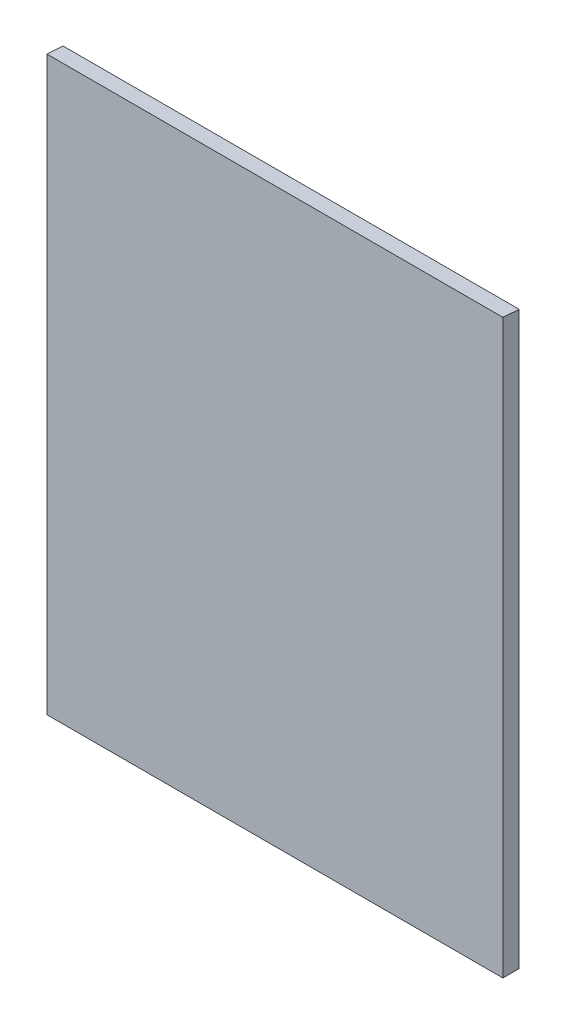
ISO-10303-21;
HEADER;
FILE_DESCRIPTION(('STEP AP214'),'2;1');
FILE_NAME('part.step','',(''),(''),'','','');
FILE_SCHEMA(('AUTOMOTIVE_DESIGN { 1 0 10303 214 1 1 1 1 }'));
ENDSEC;
DATA;
#1=APPLICATION_CONTEXT('core data for automotive mechanical design processes');
#2=APPLICATION_PROTOCOL_DEFINITION('international standard','automotive_design',2000,#1);
#3=PRODUCT_CONTEXT('',#1,'mechanical');
#4=PRODUCT('Part','Part','',(#3));
#5=PRODUCT_RELATED_PRODUCT_CATEGORY('part','',(#4));
#6=PRODUCT_DEFINITION_FORMATION('','',#4);
#7=PRODUCT_DEFINITION_CONTEXT('part definition',#1,'design');
#8=PRODUCT_DEFINITION('design','',#6,#7);
#9=PRODUCT_DEFINITION_SHAPE('','',#8);
#10=(LENGTH_UNIT() NAMED_UNIT(*) SI_UNIT(.MILLI.,.METRE.));
#11=(NAMED_UNIT(*) PLANE_ANGLE_UNIT() SI_UNIT($,.RADIAN.));
#12=(NAMED_UNIT(*) SI_UNIT($,.STERADIAN.) SOLID_ANGLE_UNIT());
#13=UNCERTAINTY_MEASURE_WITH_UNIT(LENGTH_MEASURE(1.E-05),#10,'distance_accuracy_value','');
#14=(GEOMETRIC_REPRESENTATION_CONTEXT(3) GLOBAL_UNCERTAINTY_ASSIGNED_CONTEXT((#13)) GLOBAL_UNIT_ASSIGNED_CONTEXT((#10,
#11,#12)) REPRESENTATION_CONTEXT('',''));
#15=CARTESIAN_POINT('',(0.,0.,0.));
#16=DIRECTION('',(0.,0.,1.));
#17=DIRECTION('',(1.,0.,0.));
#18=AXIS2_PLACEMENT_3D('',#15,#16,#17);
#19=CARTESIAN_POINT('',(-266.573,2683.51,-19.05));
#20=DIRECTION('',(-1.,0.,0.));
#21=DIRECTION('',(0.,0.,1.));
#22=AXIS2_PLACEMENT_3D('',#19,#20,#21);
#23=PLANE('',#22);
#24=DIRECTION('',(0.,0.0748289111293787,0.997196386906407));
#25=VECTOR('',#24,1.);
#26=CARTESIAN_POINT('',(-266.573,3343.69095387078,-114.853775760798));
#27=LINE('',#26,#25);
#28=CARTESIAN_POINT('',(-266.573,3350.88000140083,-19.05));
#29=VERTEX_POINT('',#28);
#30=CARTESIAN_POINT('',(-266.573,3352.30949974709,0.));
#31=VERTEX_POINT('',#30);
#32=EDGE_CURVE('E65',#29,#31,#27,.T.);
#33=ORIENTED_EDGE('',*,*,#32,.F.);
#34=DIRECTION('',(0.,-1.,0.));
#35=VECTOR('',#34,1.);
#36=CARTESIAN_POINT('',(-266.573,2683.51,-19.05));
#37=LINE('',#36,#35);
#38=CARTESIAN_POINT('',(-266.573,2683.51,-19.05));
#39=VERTEX_POINT('',#38);
#40=EDGE_CURVE('E90',#29,#39,#37,.T.);
#41=ORIENTED_EDGE('',*,*,#40,.T.);
#42=DIRECTION('',(0.,0.,1.));
#43=VECTOR('',#42,1.);
#44=CARTESIAN_POINT('',(-266.573,2683.51,-19.05));
#45=LINE('',#44,#43);
#46=CARTESIAN_POINT('',(-266.573,2683.51,0.));
#47=VERTEX_POINT('',#46);
#48=EDGE_CURVE('E36',#39,#47,#45,.T.);
#49=ORIENTED_EDGE('',*,*,#48,.T.);
#50=DIRECTION('',(0.,-1.,0.));
#51=VECTOR('',#50,1.);
#52=CARTESIAN_POINT('',(-266.573,2683.51,0.));
#53=LINE('',#52,#51);
#54=EDGE_CURVE('E81',#31,#47,#53,.T.);
#55=ORIENTED_EDGE('',*,*,#54,.F.);
#56=EDGE_LOOP('',(#33,#41,#49,#55));
#57=FACE_BOUND('',#56,.T.);
#58=ADVANCED_FACE('F33',(#57),#23,.T.);
#59=CARTESIAN_POINT('',(266.573,2683.51,-19.05));
#60=DIRECTION('',(1.,0.,0.));
#61=DIRECTION('',(0.,1.,0.));
#62=AXIS2_PLACEMENT_3D('',#59,#60,#61);
#63=PLANE('',#62);
#64=DIRECTION('',(0.,0.0748289111293787,0.997196386906407));
#65=VECTOR('',#64,1.);
#66=CARTESIAN_POINT('',(266.573,3343.69095387078,-114.853775760798));
#67=LINE('',#66,#65);
#68=CARTESIAN_POINT('',(266.573,3350.88000140083,-19.05));
#69=VERTEX_POINT('',#68);
#70=CARTESIAN_POINT('',(266.573,3352.30949974709,-2.28561791715265E-06));
#71=VERTEX_POINT('',#70);
#72=EDGE_CURVE('E78',#69,#71,#67,.T.);
#73=ORIENTED_EDGE('',*,*,#72,.T.);
#74=DIRECTION('',(0.,1.,0.));
#75=VECTOR('',#74,1.);
#76=CARTESIAN_POINT('',(266.573,2683.51,0.));
#77=LINE('',#76,#75);
#78=CARTESIAN_POINT('',(266.573,2683.51,0.));
#79=VERTEX_POINT('',#78);
#80=EDGE_CURVE('E89',#79,#71,#77,.T.);
#81=ORIENTED_EDGE('',*,*,#80,.F.);
#82=DIRECTION('',(0.,0.,1.));
#83=VECTOR('',#82,1.);
#84=CARTESIAN_POINT('',(266.573,2683.51,-19.05));
#85=LINE('',#84,#83);
#86=CARTESIAN_POINT('',(266.573,2683.51,-19.05));
#87=VERTEX_POINT('',#86);
#88=EDGE_CURVE('E11',#87,#79,#85,.T.);
#89=ORIENTED_EDGE('',*,*,#88,.F.);
#90=DIRECTION('',(0.,1.,0.));
#91=VECTOR('',#90,1.);
#92=CARTESIAN_POINT('',(266.573,2683.51,-19.05));
#93=LINE('',#92,#91);
#94=EDGE_CURVE('E97',#87,#69,#93,.T.);
#95=ORIENTED_EDGE('',*,*,#94,.T.);
#96=EDGE_LOOP('',(#73,#81,#89,#95));
#97=FACE_BOUND('',#96,.T.);
#98=ADVANCED_FACE('F101',(#97),#63,.T.);
#99=CARTESIAN_POINT('',(-266.573,2683.51,-19.05));
#100=DIRECTION('',(0.,-1.,0.));
#101=DIRECTION('',(0.,0.,-1.));
#102=AXIS2_PLACEMENT_3D('',#99,#100,#101);
#103=PLANE('',#102);
#104=DIRECTION('',(1.,0.,0.));
#105=VECTOR('',#104,1.);
#106=CARTESIAN_POINT('',(-266.573,2683.51,0.));
#107=LINE('',#106,#105);
#108=EDGE_CURVE('E85',#47,#79,#107,.T.);
#109=ORIENTED_EDGE('',*,*,#108,.F.);
#110=ORIENTED_EDGE('',*,*,#48,.F.);
#111=DIRECTION('',(1.,0.,0.));
#112=VECTOR('',#111,1.);
#113=CARTESIAN_POINT('',(-266.573,2683.51,-19.05));
#114=LINE('',#113,#112);
#115=EDGE_CURVE('E92',#39,#87,#114,.T.);
#116=ORIENTED_EDGE('',*,*,#115,.T.);
#117=ORIENTED_EDGE('',*,*,#88,.T.);
#118=EDGE_LOOP('',(#109,#110,#116,#117));
#119=FACE_BOUND('',#118,.T.);
#120=ADVANCED_FACE('F107',(#119),#103,.T.);
#121=CARTESIAN_POINT('',(0.,0.,-19.05));
#122=DIRECTION('',(0.,0.,-1.));
#123=DIRECTION('',(-1.,0.,0.));
#124=AXIS2_PLACEMENT_3D('',#121,#122,#123);
#125=PLANE('',#124);
#126=DIRECTION('',(-1.,0.,0.));
#127=VECTOR('',#126,1.);
#128=CARTESIAN_POINT('',(0.,3350.88000140083,-19.05));
#129=LINE('',#128,#127);
#130=EDGE_CURVE('E75',#69,#29,#129,.T.);
#131=ORIENTED_EDGE('',*,*,#130,.F.);
#132=ORIENTED_EDGE('',*,*,#94,.F.);
#133=ORIENTED_EDGE('',*,*,#115,.F.);
#134=ORIENTED_EDGE('',*,*,#40,.F.);
#135=EDGE_LOOP('',(#131,#132,#133,#134));
#136=FACE_BOUND('',#135,.T.);
#137=ADVANCED_FACE('F104',(#136),#125,.T.);
#138=CARTESIAN_POINT('',(0.,0.,0.));
#139=DIRECTION('',(0.,0.,-1.));
#140=DIRECTION('',(-1.,0.,0.));
#141=AXIS2_PLACEMENT_3D('',#138,#139,#140);
#142=PLANE('',#141);
#143=ORIENTED_EDGE('',*,*,#54,.T.);
#144=ORIENTED_EDGE('',*,*,#108,.T.);
#145=ORIENTED_EDGE('',*,*,#80,.T.);
#146=DIRECTION('',(-1.,0.,0.));
#147=VECTOR('',#146,1.);
#148=CARTESIAN_POINT('',(-266.573,3352.30949974709,0.));
#149=LINE('',#148,#147);
#150=EDGE_CURVE('E71',#71,#31,#149,.T.);
#151=ORIENTED_EDGE('',*,*,#150,.T.);
#152=EDGE_LOOP('',(#143,#144,#145,#151));
#153=FACE_BOUND('',#152,.T.);
#154=ADVANCED_FACE('F88',(#153),#142,.F.);
#155=CARTESIAN_POINT('',(266.573,3343.69095387078,-114.853775760798));
#156=DIRECTION('',(0.,-0.997196386906407,0.0748289111293787));
#157=DIRECTION('',(0.,-0.0748289111293787,-0.997196386906407));
#158=AXIS2_PLACEMENT_3D('',#155,#156,#157);
#159=PLANE('',#158);
#160=ORIENTED_EDGE('',*,*,#130,.T.);
#161=ORIENTED_EDGE('',*,*,#32,.T.);
#162=ORIENTED_EDGE('',*,*,#150,.F.);
#163=ORIENTED_EDGE('',*,*,#72,.F.);
#164=EDGE_LOOP('',(#160,#161,#162,#163));
#165=FACE_BOUND('',#164,.T.);
#166=ADVANCED_FACE('F67',(#165),#159,.F.);
#167=CLOSED_SHELL('',(#58,#98,#120,#137,#154,#166));
#168=MANIFOLD_SOLID_BREP('B2',#167);
#169=ADVANCED_BREP_SHAPE_REPRESENTATION('',(#18,#168),#14);
#170=SHAPE_DEFINITION_REPRESENTATION(#9,#169);
ENDSEC;
END-ISO-10303-21;
